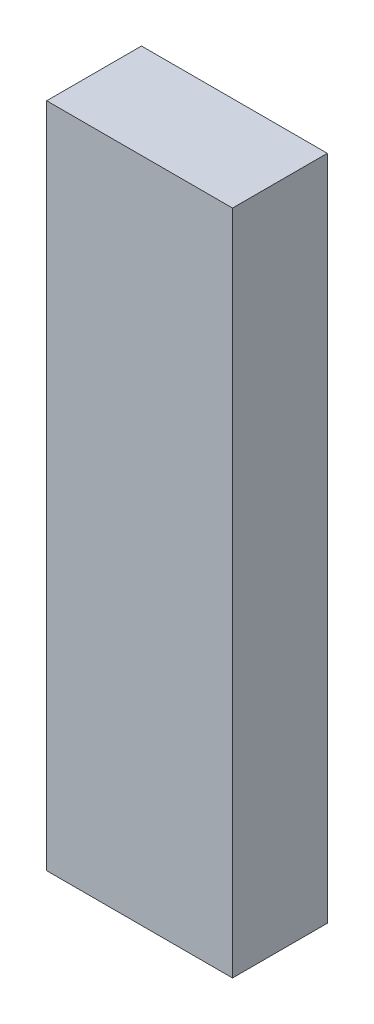
ISO-10303-21;
HEADER;
FILE_DESCRIPTION(('STEP AP214'),'2;1');
FILE_NAME('part.step','',(''),(''),'','','');
FILE_SCHEMA(('AUTOMOTIVE_DESIGN { 1 0 10303 214 1 1 1 1 }'));
ENDSEC;
DATA;
#1=APPLICATION_CONTEXT('core data for automotive mechanical design processes');
#2=APPLICATION_PROTOCOL_DEFINITION('international standard','automotive_design',2000,#1);
#3=PRODUCT_CONTEXT('',#1,'mechanical');
#4=PRODUCT('Part','Part','',(#3));
#5=PRODUCT_RELATED_PRODUCT_CATEGORY('part','',(#4));
#6=PRODUCT_DEFINITION_FORMATION('','',#4);
#7=PRODUCT_DEFINITION_CONTEXT('part definition',#1,'design');
#8=PRODUCT_DEFINITION('design','',#6,#7);
#9=PRODUCT_DEFINITION_SHAPE('','',#8);
#10=(LENGTH_UNIT() NAMED_UNIT(*) SI_UNIT(.MILLI.,.METRE.));
#11=(NAMED_UNIT(*) PLANE_ANGLE_UNIT() SI_UNIT($,.RADIAN.));
#12=(NAMED_UNIT(*) SI_UNIT($,.STERADIAN.) SOLID_ANGLE_UNIT());
#13=UNCERTAINTY_MEASURE_WITH_UNIT(LENGTH_MEASURE(1.E-05),#10,'distance_accuracy_value','');
#14=(GEOMETRIC_REPRESENTATION_CONTEXT(3) GLOBAL_UNCERTAINTY_ASSIGNED_CONTEXT((#13)) GLOBAL_UNIT_ASSIGNED_CONTEXT((#10,
#11,#12)) REPRESENTATION_CONTEXT('',''));
#15=CARTESIAN_POINT('',(0.,0.,0.));
#16=DIRECTION('',(0.,0.,1.));
#17=DIRECTION('',(1.,0.,0.));
#18=AXIS2_PLACEMENT_3D('',#15,#16,#17);
#19=CARTESIAN_POINT('',(2.45,8.79,2.5));
#20=DIRECTION('',(-1.,0.,0.));
#21=DIRECTION('',(0.,-1.,0.));
#22=AXIS2_PLACEMENT_3D('',#19,#20,#21);
#23=PLANE('',#22);
#24=DIRECTION('',(0.,1.,0.));
#25=VECTOR('',#24,1.);
#26=CARTESIAN_POINT('',(2.45,8.79,0.));
#27=LINE('',#26,#25);
#28=CARTESIAN_POINT('',(2.45,-8.79,0.));
#29=VERTEX_POINT('',#28);
#30=CARTESIAN_POINT('',(2.45,8.79,0.));
#31=VERTEX_POINT('',#30);
#32=EDGE_CURVE('E95',#29,#31,#27,.T.);
#33=ORIENTED_EDGE('',*,*,#32,.T.);
#34=DIRECTION('',(0.,0.,-1.));
#35=VECTOR('',#34,1.);
#36=CARTESIAN_POINT('',(2.45,8.79,2.5));
#37=LINE('',#36,#35);
#38=CARTESIAN_POINT('',(2.45,8.79,2.5));
#39=VERTEX_POINT('',#38);
#40=EDGE_CURVE('E11',#39,#31,#37,.T.);
#41=ORIENTED_EDGE('',*,*,#40,.F.);
#42=DIRECTION('',(0.,1.,0.));
#43=VECTOR('',#42,1.);
#44=CARTESIAN_POINT('',(2.45,8.79,2.5));
#45=LINE('',#44,#43);
#46=CARTESIAN_POINT('',(2.45,-8.79,2.5));
#47=VERTEX_POINT('',#46);
#48=EDGE_CURVE('E83',#47,#39,#45,.T.);
#49=ORIENTED_EDGE('',*,*,#48,.F.);
#50=DIRECTION('',(0.,0.,-1.));
#51=VECTOR('',#50,1.);
#52=CARTESIAN_POINT('',(2.45,-8.79,2.5));
#53=LINE('',#52,#51);
#54=EDGE_CURVE('E91',#47,#29,#53,.T.);
#55=ORIENTED_EDGE('',*,*,#54,.T.);
#56=EDGE_LOOP('',(#33,#41,#49,#55));
#57=FACE_BOUND('',#56,.T.);
#58=ADVANCED_FACE('F32',(#57),#23,.F.);
#59=CARTESIAN_POINT('',(-2.45,8.79,2.5));
#60=DIRECTION('',(0.,-1.,0.));
#61=DIRECTION('',(0.,0.,-1.));
#62=AXIS2_PLACEMENT_3D('',#59,#60,#61);
#63=PLANE('',#62);
#64=DIRECTION('',(-1.,0.,0.));
#65=VECTOR('',#64,1.);
#66=CARTESIAN_POINT('',(-2.45,8.79,0.));
#67=LINE('',#66,#65);
#68=CARTESIAN_POINT('',(-2.45,8.79,0.));
#69=VERTEX_POINT('',#68);
#70=EDGE_CURVE('E87',#31,#69,#67,.T.);
#71=ORIENTED_EDGE('',*,*,#70,.T.);
#72=DIRECTION('',(0.,0.,-1.));
#73=VECTOR('',#72,1.);
#74=CARTESIAN_POINT('',(-2.45,8.79,2.5));
#75=LINE('',#74,#73);
#76=CARTESIAN_POINT('',(-2.45,8.79,2.5));
#77=VERTEX_POINT('',#76);
#78=EDGE_CURVE('E40',#77,#69,#75,.T.);
#79=ORIENTED_EDGE('',*,*,#78,.F.);
#80=DIRECTION('',(-1.,0.,0.));
#81=VECTOR('',#80,1.);
#82=CARTESIAN_POINT('',(-2.45,8.79,2.5));
#83=LINE('',#82,#81);
#84=EDGE_CURVE('E78',#39,#77,#83,.T.);
#85=ORIENTED_EDGE('',*,*,#84,.F.);
#86=ORIENTED_EDGE('',*,*,#40,.T.);
#87=EDGE_LOOP('',(#71,#79,#85,#86));
#88=FACE_BOUND('',#87,.T.);
#89=ADVANCED_FACE('F86',(#88),#63,.F.);
#90=CARTESIAN_POINT('',(-2.45,8.79,2.5));
#91=DIRECTION('',(1.,0.,0.));
#92=DIRECTION('',(0.,1.,0.));
#93=AXIS2_PLACEMENT_3D('',#90,#91,#92);
#94=PLANE('',#93);
#95=DIRECTION('',(0.,-1.,0.));
#96=VECTOR('',#95,1.);
#97=CARTESIAN_POINT('',(-2.45,8.79,0.));
#98=LINE('',#97,#96);
#99=CARTESIAN_POINT('',(-2.45,-8.79,0.));
#100=VERTEX_POINT('',#99);
#101=EDGE_CURVE('E65',#69,#100,#98,.T.);
#102=ORIENTED_EDGE('',*,*,#101,.T.);
#103=DIRECTION('',(0.,0.,-1.));
#104=VECTOR('',#103,1.);
#105=CARTESIAN_POINT('',(-2.45,-8.79,2.5));
#106=LINE('',#105,#104);
#107=CARTESIAN_POINT('',(-2.45,-8.79,2.5));
#108=VERTEX_POINT('',#107);
#109=EDGE_CURVE('E88',#108,#100,#106,.T.);
#110=ORIENTED_EDGE('',*,*,#109,.F.);
#111=DIRECTION('',(0.,-1.,0.));
#112=VECTOR('',#111,1.);
#113=CARTESIAN_POINT('',(-2.45,8.79,2.5));
#114=LINE('',#113,#112);
#115=EDGE_CURVE('E81',#77,#108,#114,.T.);
#116=ORIENTED_EDGE('',*,*,#115,.F.);
#117=ORIENTED_EDGE('',*,*,#78,.T.);
#118=EDGE_LOOP('',(#102,#110,#116,#117));
#119=FACE_BOUND('',#118,.T.);
#120=ADVANCED_FACE('F89',(#119),#94,.F.);
#121=CARTESIAN_POINT('',(-2.45,-8.79,2.5));
#122=DIRECTION('',(0.,1.,0.));
#123=DIRECTION('',(0.,0.,1.));
#124=AXIS2_PLACEMENT_3D('',#121,#122,#123);
#125=PLANE('',#124);
#126=DIRECTION('',(1.,0.,0.));
#127=VECTOR('',#126,1.);
#128=CARTESIAN_POINT('',(-2.45,-8.79,0.));
#129=LINE('',#128,#127);
#130=EDGE_CURVE('E71',#100,#29,#129,.T.);
#131=ORIENTED_EDGE('',*,*,#130,.T.);
#132=ORIENTED_EDGE('',*,*,#54,.F.);
#133=DIRECTION('',(1.,0.,0.));
#134=VECTOR('',#133,1.);
#135=CARTESIAN_POINT('',(-2.45,-8.79,2.5));
#136=LINE('',#135,#134);
#137=EDGE_CURVE('E48',#108,#47,#136,.T.);
#138=ORIENTED_EDGE('',*,*,#137,.F.);
#139=ORIENTED_EDGE('',*,*,#109,.T.);
#140=EDGE_LOOP('',(#131,#132,#138,#139));
#141=FACE_BOUND('',#140,.T.);
#142=ADVANCED_FACE('F102',(#141),#125,.F.);
#143=CARTESIAN_POINT('',(0.,0.,2.5));
#144=DIRECTION('',(0.,0.,1.));
#145=DIRECTION('',(1.,0.,0.));
#146=AXIS2_PLACEMENT_3D('',#143,#144,#145);
#147=PLANE('',#146);
#148=ORIENTED_EDGE('',*,*,#48,.T.);
#149=ORIENTED_EDGE('',*,*,#84,.T.);
#150=ORIENTED_EDGE('',*,*,#115,.T.);
#151=ORIENTED_EDGE('',*,*,#137,.T.);
#152=EDGE_LOOP('',(#148,#149,#150,#151));
#153=FACE_BOUND('',#152,.T.);
#154=ADVANCED_FACE('F79',(#153),#147,.T.);
#155=CARTESIAN_POINT('',(0.,0.,0.));
#156=DIRECTION('',(0.,0.,1.));
#157=DIRECTION('',(1.,0.,0.));
#158=AXIS2_PLACEMENT_3D('',#155,#156,#157);
#159=PLANE('',#158);
#160=ORIENTED_EDGE('',*,*,#32,.F.);
#161=ORIENTED_EDGE('',*,*,#130,.F.);
#162=ORIENTED_EDGE('',*,*,#101,.F.);
#163=ORIENTED_EDGE('',*,*,#70,.F.);
#164=EDGE_LOOP('',(#160,#161,#162,#163));
#165=FACE_BOUND('',#164,.T.);
#166=ADVANCED_FACE('F105',(#165),#159,.F.);
#167=CLOSED_SHELL('',(#58,#89,#120,#142,#154,#166));
#168=MANIFOLD_SOLID_BREP('B2',#167);
#169=ADVANCED_BREP_SHAPE_REPRESENTATION('',(#18,#168),#14);
#170=SHAPE_DEFINITION_REPRESENTATION(#9,#169);
ENDSEC;
END-ISO-10303-21;
